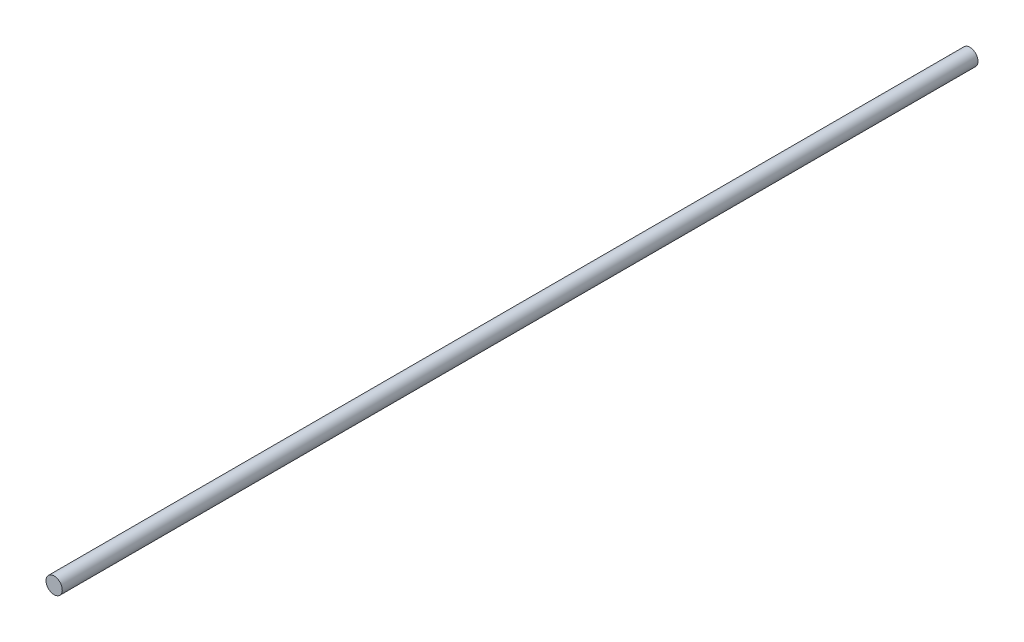
ISO-10303-21;
HEADER;
FILE_DESCRIPTION(('STEP AP214'),'2;1');
FILE_NAME('part.step','',(''),(''),'','','');
FILE_SCHEMA(('AUTOMOTIVE_DESIGN { 1 0 10303 214 1 1 1 1 }'));
ENDSEC;
DATA;
#1=APPLICATION_CONTEXT('core data for automotive mechanical design processes');
#2=APPLICATION_PROTOCOL_DEFINITION('international standard','automotive_design',2000,#1);
#3=PRODUCT_CONTEXT('',#1,'mechanical');
#4=PRODUCT('Part','Part','',(#3));
#5=PRODUCT_RELATED_PRODUCT_CATEGORY('part','',(#4));
#6=PRODUCT_DEFINITION_FORMATION('','',#4);
#7=PRODUCT_DEFINITION_CONTEXT('part definition',#1,'design');
#8=PRODUCT_DEFINITION('design','',#6,#7);
#9=PRODUCT_DEFINITION_SHAPE('','',#8);
#10=(LENGTH_UNIT() NAMED_UNIT(*) SI_UNIT(.MILLI.,.METRE.));
#11=(NAMED_UNIT(*) PLANE_ANGLE_UNIT() SI_UNIT($,.RADIAN.));
#12=(NAMED_UNIT(*) SI_UNIT($,.STERADIAN.) SOLID_ANGLE_UNIT());
#13=UNCERTAINTY_MEASURE_WITH_UNIT(LENGTH_MEASURE(1.E-05),#10,'distance_accuracy_value','');
#14=(GEOMETRIC_REPRESENTATION_CONTEXT(3) GLOBAL_UNCERTAINTY_ASSIGNED_CONTEXT((#13)) GLOBAL_UNIT_ASSIGNED_CONTEXT((#10,
#11,#12)) REPRESENTATION_CONTEXT('',''));
#15=CARTESIAN_POINT('',(0.,0.,0.));
#16=DIRECTION('',(0.,0.,1.));
#17=DIRECTION('',(1.,0.,0.));
#18=AXIS2_PLACEMENT_3D('',#15,#16,#17);
#19=CARTESIAN_POINT('',(0.,0.,450.));
#20=DIRECTION('',(0.,0.,-1.));
#21=DIRECTION('',(-1.,0.,0.));
#22=AXIS2_PLACEMENT_3D('',#19,#20,#21);
#23=CYLINDRICAL_SURFACE('',#22,4.);
#24=CARTESIAN_POINT('',(0.,0.,450.));
#25=DIRECTION('',(0.,0.,1.));
#26=DIRECTION('',(1.,0.,0.));
#27=AXIS2_PLACEMENT_3D('',#24,#25,#26);
#28=CIRCLE('',#27,4.);
#29=CARTESIAN_POINT('',(4.,0.,450.));
#30=VERTEX_POINT('',#29);
#31=EDGE_CURVE('E10',#30,#30,#28,.T.);
#32=ORIENTED_EDGE('',*,*,#31,.F.);
#33=EDGE_LOOP('',(#32));
#34=FACE_BOUND('',#33,.T.);
#35=CARTESIAN_POINT('',(0.,0.,0.));
#36=DIRECTION('',(0.,0.,1.));
#37=DIRECTION('',(1.,0.,0.));
#38=AXIS2_PLACEMENT_3D('',#35,#36,#37);
#39=CIRCLE('',#38,4.);
#40=CARTESIAN_POINT('',(4.,0.,0.));
#41=VERTEX_POINT('',#40);
#42=EDGE_CURVE('E46',#41,#41,#39,.T.);
#43=ORIENTED_EDGE('',*,*,#42,.T.);
#44=EDGE_LOOP('',(#43));
#45=FACE_BOUND('',#44,.T.);
#46=ADVANCED_FACE('F43',(#34,#45),#23,.T.);
#47=CARTESIAN_POINT('',(0.,0.,450.));
#48=DIRECTION('',(0.,0.,1.));
#49=DIRECTION('',(1.,0.,0.));
#50=AXIS2_PLACEMENT_3D('',#47,#48,#49);
#51=PLANE('',#50);
#52=ORIENTED_EDGE('',*,*,#31,.T.);
#53=EDGE_LOOP('',(#52));
#54=FACE_BOUND('',#53,.T.);
#55=ADVANCED_FACE('F60',(#54),#51,.T.);
#56=CARTESIAN_POINT('',(0.,0.,0.));
#57=DIRECTION('',(0.,0.,1.));
#58=DIRECTION('',(1.,0.,0.));
#59=AXIS2_PLACEMENT_3D('',#56,#57,#58);
#60=PLANE('',#59);
#61=ORIENTED_EDGE('',*,*,#42,.F.);
#62=EDGE_LOOP('',(#61));
#63=FACE_BOUND('',#62,.T.);
#64=ADVANCED_FACE('F58',(#63),#60,.F.);
#65=CLOSED_SHELL('',(#46,#55,#64));
#66=MANIFOLD_SOLID_BREP('B2',#65);
#67=ADVANCED_BREP_SHAPE_REPRESENTATION('',(#18,#66),#14);
#68=SHAPE_DEFINITION_REPRESENTATION(#9,#67);
ENDSEC;
END-ISO-10303-21;
